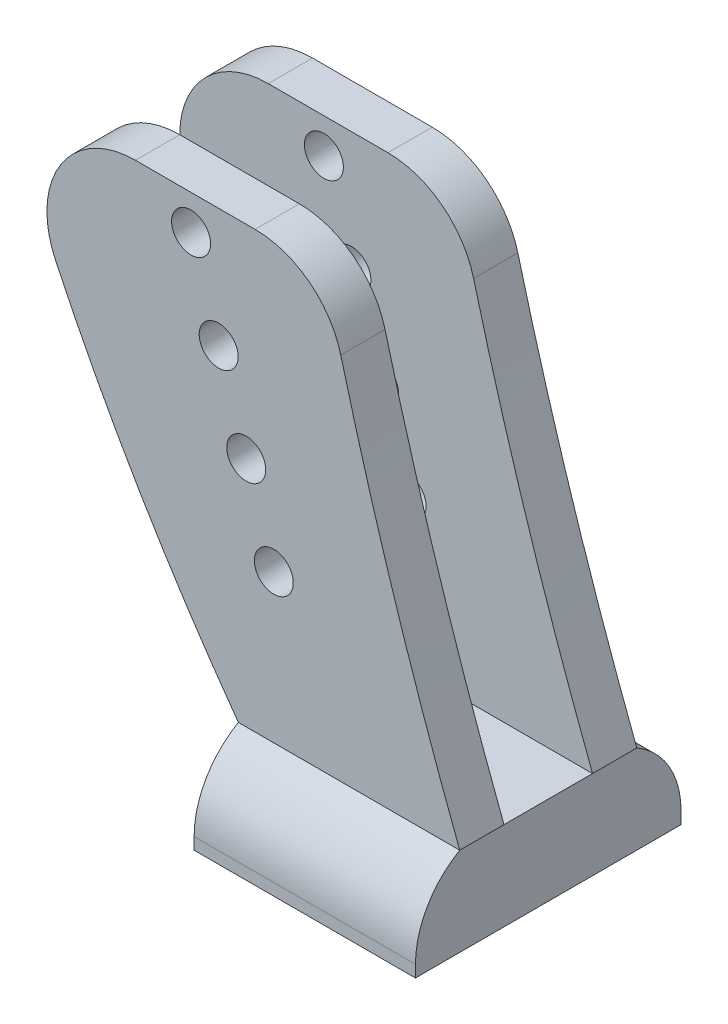
ISO-10303-21;
HEADER;
FILE_DESCRIPTION(('STEP AP214'),'2;1');
FILE_NAME('part.step','',(''),(''),'','','');
FILE_SCHEMA(('AUTOMOTIVE_DESIGN { 1 0 10303 214 1 1 1 1 }'));
ENDSEC;
DATA;
#1=APPLICATION_CONTEXT('core data for automotive mechanical design processes');
#2=APPLICATION_PROTOCOL_DEFINITION('international standard','automotive_design',2000,#1);
#3=PRODUCT_CONTEXT('',#1,'mechanical');
#4=PRODUCT('Part','Part','',(#3));
#5=PRODUCT_RELATED_PRODUCT_CATEGORY('part','',(#4));
#6=PRODUCT_DEFINITION_FORMATION('','',#4);
#7=PRODUCT_DEFINITION_CONTEXT('part definition',#1,'design');
#8=PRODUCT_DEFINITION('design','',#6,#7);
#9=PRODUCT_DEFINITION_SHAPE('','',#8);
#10=(LENGTH_UNIT() NAMED_UNIT(*) SI_UNIT(.MILLI.,.METRE.));
#11=(NAMED_UNIT(*) PLANE_ANGLE_UNIT() SI_UNIT($,.RADIAN.));
#12=(NAMED_UNIT(*) SI_UNIT($,.STERADIAN.) SOLID_ANGLE_UNIT());
#13=UNCERTAINTY_MEASURE_WITH_UNIT(LENGTH_MEASURE(1.E-05),#10,'distance_accuracy_value','');
#14=(GEOMETRIC_REPRESENTATION_CONTEXT(3) GLOBAL_UNCERTAINTY_ASSIGNED_CONTEXT((#13)) GLOBAL_UNIT_ASSIGNED_CONTEXT((#10,
#11,#12)) REPRESENTATION_CONTEXT('',''));
#15=CARTESIAN_POINT('',(0.,0.,0.));
#16=DIRECTION('',(0.,0.,1.));
#17=DIRECTION('',(1.,0.,0.));
#18=AXIS2_PLACEMENT_3D('',#15,#16,#17);
#19=CARTESIAN_POINT('',(0.,29.5863683971318,5.));
#20=DIRECTION('',(0.,-1.,0.));
#21=DIRECTION('',(0.,0.,-1.));
#22=AXIS2_PLACEMENT_3D('',#19,#20,#21);
#23=PLANE('',#22);
#24=DIRECTION('',(-1.,0.,0.));
#25=VECTOR('',#24,1.);
#26=CARTESIAN_POINT('',(-20.,29.5863683971318,-2.5));
#27=LINE('',#26,#25);
#28=CARTESIAN_POINT('',(-5.30285763988295,29.5863683971318,-2.5));
#29=VERTEX_POINT('',#28);
#30=CARTESIAN_POINT('',(-12.0614701095576,29.5863683971318,-2.5));
#31=VERTEX_POINT('',#30);
#32=EDGE_CURVE('E416',#29,#31,#27,.T.);
#33=ORIENTED_EDGE('',*,*,#32,.F.);
#34=DIRECTION('',(0.,0.,1.));
#35=VECTOR('',#34,1.);
#36=CARTESIAN_POINT('',(-5.30285763988295,29.5863683971318,-5.));
#37=LINE('',#36,#35);
#38=CARTESIAN_POINT('',(-5.30285763988295,29.5863683971318,-5.));
#39=VERTEX_POINT('',#38);
#40=EDGE_CURVE('E273',#29,#39,#37,.F.);
#41=ORIENTED_EDGE('',*,*,#40,.T.);
#42=DIRECTION('',(-1.,0.,0.));
#43=VECTOR('',#42,1.);
#44=CARTESIAN_POINT('',(0.,29.5863683971318,-5.));
#45=LINE('',#44,#43);
#46=CARTESIAN_POINT('',(-12.0614701095576,29.5863683971318,-5.));
#47=VERTEX_POINT('',#46);
#48=EDGE_CURVE('E323',#39,#47,#45,.T.);
#49=ORIENTED_EDGE('',*,*,#48,.T.);
#50=DIRECTION('',(0.,0.,-1.));
#51=VECTOR('',#50,1.);
#52=CARTESIAN_POINT('',(-12.0614701095576,29.5863683971318,5.));
#53=LINE('',#52,#51);
#54=EDGE_CURVE('E270',#47,#31,#53,.F.);
#55=ORIENTED_EDGE('',*,*,#54,.T.);
#56=EDGE_LOOP('',(#33,#41,#49,#55));
#57=FACE_BOUND('',#56,.T.);
#58=ADVANCED_FACE('F40',(#57),#23,.F.);
#59=CARTESIAN_POINT('',(82.8336258581263,69.5298969778302,5.));
#60=DIRECTION('',(0.,0.,-1.));
#61=DIRECTION('',(-1.,0.,0.));
#62=AXIS2_PLACEMENT_3D('',#59,#60,#61);
#63=CYLINDRICAL_SURFACE('',#62,110.);
#64=CARTESIAN_POINT('',(82.8336258581263,69.5298969778302,-2.5));
#65=DIRECTION('',(0.,0.,-1.));
#66=DIRECTION('',(-1.,0.,0.));
#67=AXIS2_PLACEMENT_3D('',#64,#65,#66);
#68=CIRCLE('',#67,110.);
#69=CARTESIAN_POINT('',(-6.24999999999994,5.,-2.5));
#70=VERTEX_POINT('',#69);
#71=CARTESIAN_POINT('',(-16.5802842032568,22.4462003694794,-2.5));
#72=VERTEX_POINT('',#71);
#73=EDGE_CURVE('E185',#70,#72,#68,.T.);
#74=ORIENTED_EDGE('',*,*,#73,.T.);
#75=DIRECTION('',(0.,0.,-1.));
#76=VECTOR('',#75,1.);
#77=CARTESIAN_POINT('',(-16.5802842032569,22.4462003694794,5.));
#78=LINE('',#77,#76);
#79=CARTESIAN_POINT('',(-16.5802842032568,22.4462003694794,-5.));
#80=VERTEX_POINT('',#79);
#81=EDGE_CURVE('E292',#72,#80,#78,.T.);
#82=ORIENTED_EDGE('',*,*,#81,.T.);
#83=CARTESIAN_POINT('',(82.8336258581263,69.5298969778302,-5.));
#84=DIRECTION('',(0.,0.,-1.));
#85=DIRECTION('',(-1.,0.,0.));
#86=AXIS2_PLACEMENT_3D('',#83,#84,#85);
#87=CIRCLE('',#86,110.);
#88=CARTESIAN_POINT('',(-6.25,5.,-5.));
#89=VERTEX_POINT('',#88);
#90=EDGE_CURVE('E210',#80,#89,#87,.F.);
#91=ORIENTED_EDGE('',*,*,#90,.T.);
#92=DIRECTION('',(0.,0.,-1.));
#93=VECTOR('',#92,1.);
#94=CARTESIAN_POINT('',(-6.25,5.,5.));
#95=LINE('',#94,#93);
#96=EDGE_CURVE('E200',#70,#89,#95,.T.);
#97=ORIENTED_EDGE('',*,*,#96,.F.);
#98=EDGE_LOOP('',(#74,#82,#91,#97));
#99=FACE_BOUND('',#98,.T.);
#100=ADVANCED_FACE('F449',(#99),#63,.T.);
#101=CARTESIAN_POINT('',(-4.24954389251572,13.3691989771711,5.));
#102=DIRECTION('',(0.,0.,-1.));
#103=DIRECTION('',(-1.,0.,0.));
#104=AXIS2_PLACEMENT_3D('',#101,#102,#103);
#105=CYLINDRICAL_SURFACE('',#104,1.10000000000001);
#106=CARTESIAN_POINT('',(-4.24954389251572,13.3691989771711,-2.5));
#107=DIRECTION('',(0.,0.,-1.));
#108=DIRECTION('',(-1.,0.,0.));
#109=AXIS2_PLACEMENT_3D('',#106,#107,#108);
#110=CIRCLE('',#109,1.10000000000001);
#111=CARTESIAN_POINT('',(-5.34954389251572,13.3691989771711,-2.5));
#112=VERTEX_POINT('',#111);
#113=EDGE_CURVE('E384',#112,#112,#110,.F.);
#114=ORIENTED_EDGE('',*,*,#113,.T.);
#115=EDGE_LOOP('',(#114));
#116=FACE_BOUND('',#115,.T.);
#117=CARTESIAN_POINT('',(-4.24954389251572,13.3691989771711,-5.));
#118=DIRECTION('',(0.,0.,-1.));
#119=DIRECTION('',(-1.,0.,0.));
#120=AXIS2_PLACEMENT_3D('',#117,#118,#119);
#121=CIRCLE('',#120,1.10000000000001);
#122=CARTESIAN_POINT('',(-5.34954389251572,13.3691989771711,-5.));
#123=VERTEX_POINT('',#122);
#124=EDGE_CURVE('E338',#123,#123,#121,.T.);
#125=ORIENTED_EDGE('',*,*,#124,.T.);
#126=EDGE_LOOP('',(#125));
#127=FACE_BOUND('',#126,.T.);
#128=ADVANCED_FACE('F471',(#116,#127),#105,.F.);
#129=CARTESIAN_POINT('',(-5.80678434768063,18.1205148122633,5.));
#130=DIRECTION('',(0.,0.,-1.));
#131=DIRECTION('',(-1.,0.,0.));
#132=AXIS2_PLACEMENT_3D('',#129,#130,#131);
#133=CYLINDRICAL_SURFACE('',#132,1.10000000000001);
#134=CARTESIAN_POINT('',(-5.80678434768063,18.1205148122633,-2.5));
#135=DIRECTION('',(0.,0.,-1.));
#136=DIRECTION('',(-1.,0.,0.));
#137=AXIS2_PLACEMENT_3D('',#134,#135,#136);
#138=CIRCLE('',#137,1.10000000000001);
#139=CARTESIAN_POINT('',(-6.90678434768064,18.1205148122633,-2.5));
#140=VERTEX_POINT('',#139);
#141=EDGE_CURVE('E388',#140,#140,#138,.F.);
#142=ORIENTED_EDGE('',*,*,#141,.T.);
#143=EDGE_LOOP('',(#142));
#144=FACE_BOUND('',#143,.T.);
#145=CARTESIAN_POINT('',(-5.80678434768063,18.1205148122633,-5.));
#146=DIRECTION('',(0.,0.,-1.));
#147=DIRECTION('',(-1.,0.,0.));
#148=AXIS2_PLACEMENT_3D('',#145,#146,#147);
#149=CIRCLE('',#148,1.10000000000001);
#150=CARTESIAN_POINT('',(-6.90678434768064,18.1205148122633,-5.));
#151=VERTEX_POINT('',#150);
#152=EDGE_CURVE('E342',#151,#151,#149,.T.);
#153=ORIENTED_EDGE('',*,*,#152,.T.);
#154=EDGE_LOOP('',(#153));
#155=FACE_BOUND('',#154,.T.);
#156=ADVANCED_FACE('F539',(#144,#155),#133,.F.);
#157=CARTESIAN_POINT('',(-7.36402480284555,22.8718306473555,5.));
#158=DIRECTION('',(0.,0.,-1.));
#159=DIRECTION('',(-1.,0.,0.));
#160=AXIS2_PLACEMENT_3D('',#157,#158,#159);
#161=CYLINDRICAL_SURFACE('',#160,1.10000000000001);
#162=CARTESIAN_POINT('',(-7.36402480284555,22.8718306473555,-2.5));
#163=DIRECTION('',(0.,0.,-1.));
#164=DIRECTION('',(-1.,0.,0.));
#165=AXIS2_PLACEMENT_3D('',#162,#163,#164);
#166=CIRCLE('',#165,1.10000000000001);
#167=CARTESIAN_POINT('',(-8.46402480284555,22.8718306473555,-2.5));
#168=VERTEX_POINT('',#167);
#169=EDGE_CURVE('E392',#168,#168,#166,.F.);
#170=ORIENTED_EDGE('',*,*,#169,.T.);
#171=EDGE_LOOP('',(#170));
#172=FACE_BOUND('',#171,.T.);
#173=CARTESIAN_POINT('',(-7.36402480284555,22.8718306473555,-5.));
#174=DIRECTION('',(0.,0.,-1.));
#175=DIRECTION('',(-1.,0.,0.));
#176=AXIS2_PLACEMENT_3D('',#173,#174,#175);
#177=CIRCLE('',#176,1.10000000000001);
#178=CARTESIAN_POINT('',(-8.46402480284555,22.8718306473555,-5.));
#179=VERTEX_POINT('',#178);
#180=EDGE_CURVE('E346',#179,#179,#177,.T.);
#181=ORIENTED_EDGE('',*,*,#180,.T.);
#182=EDGE_LOOP('',(#181));
#183=FACE_BOUND('',#182,.T.);
#184=ADVANCED_FACE('F534',(#172,#183),#161,.F.);
#185=CARTESIAN_POINT('',(-8.92126525801046,27.6231464824477,5.));
#186=DIRECTION('',(0.,0.,-1.));
#187=DIRECTION('',(-1.,0.,0.));
#188=AXIS2_PLACEMENT_3D('',#185,#186,#187);
#189=CYLINDRICAL_SURFACE('',#188,1.10000000000001);
#190=CARTESIAN_POINT('',(-8.92126525801046,27.6231464824477,-2.5));
#191=DIRECTION('',(0.,0.,-1.));
#192=DIRECTION('',(-1.,0.,0.));
#193=AXIS2_PLACEMENT_3D('',#190,#191,#192);
#194=CIRCLE('',#193,1.10000000000001);
#195=CARTESIAN_POINT('',(-10.0212652580105,27.6231464824477,-2.5));
#196=VERTEX_POINT('',#195);
#197=EDGE_CURVE('E167',#196,#196,#194,.F.);
#198=ORIENTED_EDGE('',*,*,#197,.T.);
#199=EDGE_LOOP('',(#198));
#200=FACE_BOUND('',#199,.T.);
#201=CARTESIAN_POINT('',(-8.92126525801046,27.6231464824477,-5.));
#202=DIRECTION('',(0.,0.,-1.));
#203=DIRECTION('',(-1.,0.,0.));
#204=AXIS2_PLACEMENT_3D('',#201,#202,#203);
#205=CIRCLE('',#204,1.10000000000001);
#206=CARTESIAN_POINT('',(-10.0212652580105,27.6231464824477,-5.));
#207=VERTEX_POINT('',#206);
#208=EDGE_CURVE('E184',#207,#207,#205,.T.);
#209=ORIENTED_EDGE('',*,*,#208,.T.);
#210=EDGE_LOOP('',(#209));
#211=FACE_BOUND('',#210,.T.);
#212=ADVANCED_FACE('F529',(#200,#211),#189,.F.);
#213=CARTESIAN_POINT('',(192.976851013694,76.6455379665035,5.));
#214=DIRECTION('',(0.,0.,-1.));
#215=DIRECTION('',(-1.,0.,0.));
#216=AXIS2_PLACEMENT_3D('',#213,#214,#215);
#217=CYLINDRICAL_SURFACE('',#216,200.);
#218=CARTESIAN_POINT('',(192.976851013694,76.6455379665035,-5.));
#219=DIRECTION('',(0.,0.,-1.));
#220=DIRECTION('',(-1.,0.,0.));
#221=AXIS2_PLACEMENT_3D('',#218,#219,#220);
#222=CIRCLE('',#221,200.);
#223=CARTESIAN_POINT('',(-0.466767184917616,25.8561042402872,-5.));
#224=VERTEX_POINT('',#223);
#225=CARTESIAN_POINT('',(6.25,5.,-5.));
#226=VERTEX_POINT('',#225);
#227=EDGE_CURVE('E315',#224,#226,#222,.F.);
#228=ORIENTED_EDGE('',*,*,#227,.F.);
#229=DIRECTION('',(0.,0.,-1.));
#230=VECTOR('',#229,1.);
#231=CARTESIAN_POINT('',(-0.466767184917644,25.8561042402872,5.));
#232=LINE('',#231,#230);
#233=CARTESIAN_POINT('',(-0.466767184917616,25.8561042402872,-2.5));
#234=VERTEX_POINT('',#233);
#235=EDGE_CURVE('E283',#224,#234,#232,.F.);
#236=ORIENTED_EDGE('',*,*,#235,.T.);
#237=CARTESIAN_POINT('',(192.976851013694,76.6455379665035,-2.5));
#238=DIRECTION('',(0.,0.,-1.));
#239=DIRECTION('',(-1.,0.,0.));
#240=AXIS2_PLACEMENT_3D('',#237,#238,#239);
#241=CIRCLE('',#240,200.);
#242=CARTESIAN_POINT('',(6.25000000000006,4.99999999999999,-2.5));
#243=VERTEX_POINT('',#242);
#244=EDGE_CURVE('E242',#243,#234,#241,.T.);
#245=ORIENTED_EDGE('',*,*,#244,.F.);
#246=DIRECTION('',(0.,0.,-1.));
#247=VECTOR('',#246,1.);
#248=CARTESIAN_POINT('',(6.25,5.,5.));
#249=LINE('',#248,#247);
#250=EDGE_CURVE('E215',#243,#226,#249,.T.);
#251=ORIENTED_EDGE('',*,*,#250,.T.);
#252=EDGE_LOOP('',(#228,#236,#245,#251));
#253=FACE_BOUND('',#252,.T.);
#254=ADVANCED_FACE('F326',(#253),#217,.F.);
#255=CARTESIAN_POINT('',(6.25,5.,7.5));
#256=DIRECTION('',(-1.,0.,0.));
#257=DIRECTION('',(0.,0.,1.));
#258=AXIS2_PLACEMENT_3D('',#255,#256,#257);
#259=PLANE('',#258);
#260=DIRECTION('',(0.,-1.,0.));
#261=VECTOR('',#260,1.);
#262=CARTESIAN_POINT('',(6.25,5.,-7.5));
#263=LINE('',#262,#261);
#264=CARTESIAN_POINT('',(6.25,0.669872981077808,-7.5));
#265=VERTEX_POINT('',#264);
#266=CARTESIAN_POINT('',(6.25,0.,-7.5));
#267=VERTEX_POINT('',#266);
#268=EDGE_CURVE('E237',#265,#267,#263,.T.);
#269=ORIENTED_EDGE('',*,*,#268,.F.);
#270=CARTESIAN_POINT('',(6.25,0.669872981077808,-2.5));
#271=DIRECTION('',(-1.,0.,0.));
#272=DIRECTION('',(0.,0.,1.));
#273=AXIS2_PLACEMENT_3D('',#270,#271,#272);
#274=CIRCLE('',#273,5.);
#275=EDGE_CURVE('E49',#265,#226,#274,.F.);
#276=ORIENTED_EDGE('',*,*,#275,.T.);
#277=ORIENTED_EDGE('',*,*,#250,.F.);
#278=CARTESIAN_POINT('',(6.25000000000006,4.99999999999999,2.5));
#279=VERTEX_POINT('',#278);
#280=EDGE_CURVE('E214',#279,#243,#249,.T.);
#281=ORIENTED_EDGE('',*,*,#280,.F.);
#282=CARTESIAN_POINT('',(6.25,5.,5.));
#283=VERTEX_POINT('',#282);
#284=EDGE_CURVE('E207',#283,#279,#249,.T.);
#285=ORIENTED_EDGE('',*,*,#284,.F.);
#286=CARTESIAN_POINT('',(6.25,0.669872981077807,2.5));
#287=DIRECTION('',(-1.,0.,0.));
#288=DIRECTION('',(0.,0.,1.));
#289=AXIS2_PLACEMENT_3D('',#286,#287,#288);
#290=CIRCLE('',#289,5.);
#291=CARTESIAN_POINT('',(6.25,0.669872981077807,7.5));
#292=VERTEX_POINT('',#291);
#293=EDGE_CURVE('E56',#283,#292,#290,.F.);
#294=ORIENTED_EDGE('',*,*,#293,.T.);
#295=DIRECTION('',(0.,-1.,0.));
#296=VECTOR('',#295,1.);
#297=CARTESIAN_POINT('',(6.25,5.,7.5));
#298=LINE('',#297,#296);
#299=CARTESIAN_POINT('',(6.25,0.,7.5));
#300=VERTEX_POINT('',#299);
#301=EDGE_CURVE('E228',#292,#300,#298,.T.);
#302=ORIENTED_EDGE('',*,*,#301,.T.);
#303=DIRECTION('',(0.,0.,-1.));
#304=VECTOR('',#303,1.);
#305=CARTESIAN_POINT('',(6.25,0.,7.5));
#306=LINE('',#305,#304);
#307=EDGE_CURVE('E199',#300,#267,#306,.T.);
#308=ORIENTED_EDGE('',*,*,#307,.T.);
#309=EDGE_LOOP('',(#269,#276,#277,#281,#285,#294,#302,#308));
#310=FACE_BOUND('',#309,.T.);
#311=ADVANCED_FACE('F308',(#310),#259,.F.);
#312=CARTESIAN_POINT('',(-6.25,5.,-7.5));
#313=DIRECTION('',(0.,0.,1.));
#314=DIRECTION('',(1.,0.,0.));
#315=AXIS2_PLACEMENT_3D('',#312,#313,#314);
#316=PLANE('',#315);
#317=DIRECTION('',(0.,-1.,0.));
#318=VECTOR('',#317,1.);
#319=CARTESIAN_POINT('',(-6.25,5.,-7.5));
#320=LINE('',#319,#318);
#321=CARTESIAN_POINT('',(-6.25,0.669872981077808,-7.5));
#322=VERTEX_POINT('',#321);
#323=CARTESIAN_POINT('',(-6.25,0.,-7.5));
#324=VERTEX_POINT('',#323);
#325=EDGE_CURVE('E234',#322,#324,#320,.T.);
#326=ORIENTED_EDGE('',*,*,#325,.F.);
#327=DIRECTION('',(1.,0.,0.));
#328=VECTOR('',#327,1.);
#329=CARTESIAN_POINT('',(-6.25,0.669872981077808,-7.5));
#330=LINE('',#329,#328);
#331=EDGE_CURVE('E64',#322,#265,#330,.T.);
#332=ORIENTED_EDGE('',*,*,#331,.T.);
#333=ORIENTED_EDGE('',*,*,#268,.T.);
#334=DIRECTION('',(-1.,0.,0.));
#335=VECTOR('',#334,1.);
#336=CARTESIAN_POINT('',(-6.25,0.,-7.5));
#337=LINE('',#336,#335);
#338=EDGE_CURVE('E205',#267,#324,#337,.T.);
#339=ORIENTED_EDGE('',*,*,#338,.T.);
#340=EDGE_LOOP('',(#326,#332,#333,#339));
#341=FACE_BOUND('',#340,.T.);
#342=ADVANCED_FACE('F497',(#341),#316,.F.);
#343=CARTESIAN_POINT('',(-6.25,5.,7.5));
#344=DIRECTION('',(1.,0.,0.));
#345=DIRECTION('',(0.,0.,-1.));
#346=AXIS2_PLACEMENT_3D('',#343,#344,#345);
#347=PLANE('',#346);
#348=ORIENTED_EDGE('',*,*,#96,.T.);
#349=CARTESIAN_POINT('',(-6.25,0.669872981077808,-2.5));
#350=DIRECTION('',(1.,0.,0.));
#351=DIRECTION('',(0.,0.,-1.));
#352=AXIS2_PLACEMENT_3D('',#349,#350,#351);
#353=CIRCLE('',#352,5.);
#354=EDGE_CURVE('E298',#89,#322,#353,.F.);
#355=ORIENTED_EDGE('',*,*,#354,.T.);
#356=ORIENTED_EDGE('',*,*,#325,.T.);
#357=DIRECTION('',(0.,0.,1.));
#358=VECTOR('',#357,1.);
#359=CARTESIAN_POINT('',(-6.25,0.,7.5));
#360=LINE('',#359,#358);
#361=CARTESIAN_POINT('',(-6.25,0.,7.5));
#362=VERTEX_POINT('',#361);
#363=EDGE_CURVE('E220',#324,#362,#360,.T.);
#364=ORIENTED_EDGE('',*,*,#363,.T.);
#365=DIRECTION('',(0.,-1.,0.));
#366=VECTOR('',#365,1.);
#367=CARTESIAN_POINT('',(-6.25,5.,7.5));
#368=LINE('',#367,#366);
#369=CARTESIAN_POINT('',(-6.25,0.669872981077807,7.5));
#370=VERTEX_POINT('',#369);
#371=EDGE_CURVE('E231',#370,#362,#368,.T.);
#372=ORIENTED_EDGE('',*,*,#371,.F.);
#373=CARTESIAN_POINT('',(-6.25,0.669872981077807,2.5));
#374=DIRECTION('',(1.,0.,0.));
#375=DIRECTION('',(0.,0.,-1.));
#376=AXIS2_PLACEMENT_3D('',#373,#374,#375);
#377=CIRCLE('',#376,5.);
#378=CARTESIAN_POINT('',(-6.25,5.,5.));
#379=VERTEX_POINT('',#378);
#380=EDGE_CURVE('E196',#370,#379,#377,.F.);
#381=ORIENTED_EDGE('',*,*,#380,.T.);
#382=CARTESIAN_POINT('',(-6.24999999999994,5.,2.5));
#383=VERTEX_POINT('',#382);
#384=EDGE_CURVE('E160',#379,#383,#95,.T.);
#385=ORIENTED_EDGE('',*,*,#384,.T.);
#386=DIRECTION('',(0.,0.,-1.));
#387=VECTOR('',#386,1.);
#388=CARTESIAN_POINT('',(-6.24999999999994,5.,5.));
#389=LINE('',#388,#387);
#390=EDGE_CURVE('E174',#383,#70,#389,.T.);
#391=ORIENTED_EDGE('',*,*,#390,.T.);
#392=EDGE_LOOP('',(#348,#355,#356,#364,#372,#381,#385,#391));
#393=FACE_BOUND('',#392,.T.);
#394=ADVANCED_FACE('F193',(#393),#347,.F.);
#395=CARTESIAN_POINT('',(-6.25,5.,7.5));
#396=DIRECTION('',(0.,0.,-1.));
#397=DIRECTION('',(-1.,0.,0.));
#398=AXIS2_PLACEMENT_3D('',#395,#396,#397);
#399=PLANE('',#398);
#400=ORIENTED_EDGE('',*,*,#301,.F.);
#401=DIRECTION('',(1.,0.,0.));
#402=VECTOR('',#401,1.);
#403=CARTESIAN_POINT('',(-6.25,0.669872981077807,7.5));
#404=LINE('',#403,#402);
#405=EDGE_CURVE('E11',#292,#370,#404,.F.);
#406=ORIENTED_EDGE('',*,*,#405,.T.);
#407=ORIENTED_EDGE('',*,*,#371,.T.);
#408=DIRECTION('',(1.,0.,0.));
#409=VECTOR('',#408,1.);
#410=CARTESIAN_POINT('',(-6.25,0.,7.5));
#411=LINE('',#410,#409);
#412=EDGE_CURVE('E224',#362,#300,#411,.T.);
#413=ORIENTED_EDGE('',*,*,#412,.T.);
#414=EDGE_LOOP('',(#400,#406,#407,#413));
#415=FACE_BOUND('',#414,.T.);
#416=ADVANCED_FACE('F482',(#415),#399,.F.);
#417=CARTESIAN_POINT('',(0.,0.,0.));
#418=DIRECTION('',(0.,-1.,0.));
#419=DIRECTION('',(0.,0.,-1.));
#420=AXIS2_PLACEMENT_3D('',#417,#418,#419);
#421=PLANE('',#420);
#422=ORIENTED_EDGE('',*,*,#307,.F.);
#423=ORIENTED_EDGE('',*,*,#412,.F.);
#424=ORIENTED_EDGE('',*,*,#363,.F.);
#425=ORIENTED_EDGE('',*,*,#338,.F.);
#426=EDGE_LOOP('',(#422,#423,#424,#425));
#427=FACE_BOUND('',#426,.T.);
#428=ADVANCED_FACE('F476',(#427),#421,.T.);
#429=DIRECTION('',(1.,0.,0.));
#430=VECTOR('',#429,1.);
#431=CARTESIAN_POINT('',(-20.,29.5863683971318,2.5));
#432=LINE('',#431,#430);
#433=CARTESIAN_POINT('',(-12.0614701095576,29.5863683971318,2.5));
#434=VERTEX_POINT('',#433);
#435=CARTESIAN_POINT('',(-5.30285763988295,29.5863683971318,2.5));
#436=VERTEX_POINT('',#435);
#437=EDGE_CURVE('E415',#434,#436,#432,.T.);
#438=ORIENTED_EDGE('',*,*,#437,.F.);
#439=DIRECTION('',(0.,0.,-1.));
#440=VECTOR('',#439,1.);
#441=CARTESIAN_POINT('',(-12.0614701095576,29.5863683971318,5.));
#442=LINE('',#441,#440);
#443=CARTESIAN_POINT('',(-12.0614701095576,29.5863683971318,5.));
#444=VERTEX_POINT('',#443);
#445=EDGE_CURVE('E258',#434,#444,#442,.F.);
#446=ORIENTED_EDGE('',*,*,#445,.T.);
#447=DIRECTION('',(-1.,0.,0.));
#448=VECTOR('',#447,1.);
#449=CARTESIAN_POINT('',(0.,29.5863683971318,5.));
#450=LINE('',#449,#448);
#451=CARTESIAN_POINT('',(-5.30285763988295,29.5863683971318,5.));
#452=VERTEX_POINT('',#451);
#453=EDGE_CURVE('E362',#452,#444,#450,.T.);
#454=ORIENTED_EDGE('',*,*,#453,.F.);
#455=DIRECTION('',(0.,0.,1.));
#456=VECTOR('',#455,1.);
#457=CARTESIAN_POINT('',(-5.30285763988295,29.5863683971318,2.5));
#458=LINE('',#457,#456);
#459=EDGE_CURVE('E254',#452,#436,#458,.F.);
#460=ORIENTED_EDGE('',*,*,#459,.T.);
#461=EDGE_LOOP('',(#438,#446,#454,#460));
#462=FACE_BOUND('',#461,.T.);
#463=ADVANCED_FACE('F425',(#462),#23,.F.);
#464=CARTESIAN_POINT('',(82.8336258581263,69.5298969778302,5.));
#465=DIRECTION('',(0.,0.,-1.));
#466=DIRECTION('',(-1.,0.,0.));
#467=AXIS2_PLACEMENT_3D('',#464,#465,#466);
#468=CIRCLE('',#467,110.);
#469=CARTESIAN_POINT('',(-16.5802842032568,22.4462003694794,5.));
#470=VERTEX_POINT('',#469);
#471=EDGE_CURVE('E328',#470,#379,#468,.F.);
#472=ORIENTED_EDGE('',*,*,#471,.F.);
#473=DIRECTION('',(0.,0.,-1.));
#474=VECTOR('',#473,1.);
#475=CARTESIAN_POINT('',(-16.5802842032569,22.4462003694794,5.));
#476=LINE('',#475,#474);
#477=CARTESIAN_POINT('',(-16.5802842032568,22.4462003694794,2.5));
#478=VERTEX_POINT('',#477);
#479=EDGE_CURVE('E163',#470,#478,#476,.T.);
#480=ORIENTED_EDGE('',*,*,#479,.T.);
#481=CARTESIAN_POINT('',(82.8336258581263,69.5298969778302,2.5));
#482=DIRECTION('',(0.,0.,1.));
#483=DIRECTION('',(1.,0.,0.));
#484=AXIS2_PLACEMENT_3D('',#481,#482,#483);
#485=CIRCLE('',#484,110.);
#486=EDGE_CURVE('E155',#478,#383,#485,.T.);
#487=ORIENTED_EDGE('',*,*,#486,.T.);
#488=ORIENTED_EDGE('',*,*,#384,.F.);
#489=EDGE_LOOP('',(#472,#480,#487,#488));
#490=FACE_BOUND('',#489,.T.);
#491=ADVANCED_FACE('F158',(#490),#63,.T.);
#492=CARTESIAN_POINT('',(-4.24954389251572,13.3691989771711,2.5));
#493=DIRECTION('',(0.,0.,1.));
#494=DIRECTION('',(1.,0.,0.));
#495=AXIS2_PLACEMENT_3D('',#492,#493,#494);
#496=CIRCLE('',#495,1.10000000000001);
#497=CARTESIAN_POINT('',(-3.14954389251571,13.3691989771711,2.5));
#498=VERTEX_POINT('',#497);
#499=EDGE_CURVE('E168',#498,#498,#496,.F.);
#500=ORIENTED_EDGE('',*,*,#499,.T.);
#501=EDGE_LOOP('',(#500));
#502=FACE_BOUND('',#501,.T.);
#503=CARTESIAN_POINT('',(-4.24954389251572,13.3691989771711,5.));
#504=DIRECTION('',(0.,0.,-1.));
#505=DIRECTION('',(-1.,0.,0.));
#506=AXIS2_PLACEMENT_3D('',#503,#504,#505);
#507=CIRCLE('',#506,1.10000000000001);
#508=CARTESIAN_POINT('',(-5.34954389251572,13.3691989771711,5.));
#509=VERTEX_POINT('',#508);
#510=EDGE_CURVE('E366',#509,#509,#507,.T.);
#511=ORIENTED_EDGE('',*,*,#510,.F.);
#512=EDGE_LOOP('',(#511));
#513=FACE_BOUND('',#512,.T.);
#514=ADVANCED_FACE('F481',(#502,#513),#105,.F.);
#515=CARTESIAN_POINT('',(-5.80678434768063,18.1205148122633,2.5));
#516=DIRECTION('',(0.,0.,1.));
#517=DIRECTION('',(1.,0.,0.));
#518=AXIS2_PLACEMENT_3D('',#515,#516,#517);
#519=CIRCLE('',#518,1.10000000000001);
#520=CARTESIAN_POINT('',(-4.70678434768062,18.1205148122633,2.5));
#521=VERTEX_POINT('',#520);
#522=EDGE_CURVE('E402',#521,#521,#519,.F.);
#523=ORIENTED_EDGE('',*,*,#522,.T.);
#524=EDGE_LOOP('',(#523));
#525=FACE_BOUND('',#524,.T.);
#526=CARTESIAN_POINT('',(-5.80678434768063,18.1205148122633,5.));
#527=DIRECTION('',(0.,0.,-1.));
#528=DIRECTION('',(-1.,0.,0.));
#529=AXIS2_PLACEMENT_3D('',#526,#527,#528);
#530=CIRCLE('',#529,1.10000000000001);
#531=CARTESIAN_POINT('',(-6.90678434768064,18.1205148122633,5.));
#532=VERTEX_POINT('',#531);
#533=EDGE_CURVE('E370',#532,#532,#530,.T.);
#534=ORIENTED_EDGE('',*,*,#533,.F.);
#535=EDGE_LOOP('',(#534));
#536=FACE_BOUND('',#535,.T.);
#537=ADVANCED_FACE('F558',(#525,#536),#133,.F.);
#538=CARTESIAN_POINT('',(-7.36402480284555,22.8718306473555,2.5));
#539=DIRECTION('',(0.,0.,1.));
#540=DIRECTION('',(1.,0.,0.));
#541=AXIS2_PLACEMENT_3D('',#538,#539,#540);
#542=CIRCLE('',#541,1.10000000000001);
#543=CARTESIAN_POINT('',(-6.26402480284554,22.8718306473555,2.5));
#544=VERTEX_POINT('',#543);
#545=EDGE_CURVE('E406',#544,#544,#542,.F.);
#546=ORIENTED_EDGE('',*,*,#545,.T.);
#547=EDGE_LOOP('',(#546));
#548=FACE_BOUND('',#547,.T.);
#549=CARTESIAN_POINT('',(-7.36402480284555,22.8718306473555,5.));
#550=DIRECTION('',(0.,0.,-1.));
#551=DIRECTION('',(-1.,0.,0.));
#552=AXIS2_PLACEMENT_3D('',#549,#550,#551);
#553=CIRCLE('',#552,1.10000000000001);
#554=CARTESIAN_POINT('',(-8.46402480284555,22.8718306473555,5.));
#555=VERTEX_POINT('',#554);
#556=EDGE_CURVE('E374',#555,#555,#553,.T.);
#557=ORIENTED_EDGE('',*,*,#556,.F.);
#558=EDGE_LOOP('',(#557));
#559=FACE_BOUND('',#558,.T.);
#560=ADVANCED_FACE('F527',(#548,#559),#161,.F.);
#561=CARTESIAN_POINT('',(-8.92126525801046,27.6231464824477,2.5));
#562=DIRECTION('',(0.,0.,1.));
#563=DIRECTION('',(1.,0.,0.));
#564=AXIS2_PLACEMENT_3D('',#561,#562,#563);
#565=CIRCLE('',#564,1.10000000000001);
#566=CARTESIAN_POINT('',(-7.82126525801046,27.6231464824477,2.5));
#567=VERTEX_POINT('',#566);
#568=EDGE_CURVE('E191',#567,#567,#565,.F.);
#569=ORIENTED_EDGE('',*,*,#568,.T.);
#570=EDGE_LOOP('',(#569));
#571=FACE_BOUND('',#570,.T.);
#572=CARTESIAN_POINT('',(-8.92126525801046,27.6231464824477,5.));
#573=DIRECTION('',(0.,0.,-1.));
#574=DIRECTION('',(-1.,0.,0.));
#575=AXIS2_PLACEMENT_3D('',#572,#573,#574);
#576=CIRCLE('',#575,1.10000000000001);
#577=CARTESIAN_POINT('',(-10.0212652580105,27.6231464824477,5.));
#578=VERTEX_POINT('',#577);
#579=EDGE_CURVE('E333',#578,#578,#576,.T.);
#580=ORIENTED_EDGE('',*,*,#579,.F.);
#581=EDGE_LOOP('',(#580));
#582=FACE_BOUND('',#581,.T.);
#583=ADVANCED_FACE('F492',(#571,#582),#189,.F.);
#584=CARTESIAN_POINT('',(192.976851013694,76.6455379665035,2.5));
#585=DIRECTION('',(0.,0.,1.));
#586=DIRECTION('',(1.,0.,0.));
#587=AXIS2_PLACEMENT_3D('',#584,#585,#586);
#588=CIRCLE('',#587,200.);
#589=CARTESIAN_POINT('',(-0.466767184917616,25.8561042402872,2.5));
#590=VERTEX_POINT('',#589);
#591=EDGE_CURVE('E189',#590,#279,#588,.T.);
#592=ORIENTED_EDGE('',*,*,#591,.F.);
#593=DIRECTION('',(0.,0.,-1.));
#594=VECTOR('',#593,1.);
#595=CARTESIAN_POINT('',(-0.466767184917644,25.8561042402872,5.));
#596=LINE('',#595,#594);
#597=CARTESIAN_POINT('',(-0.466767184917616,25.8561042402872,5.));
#598=VERTEX_POINT('',#597);
#599=EDGE_CURVE('E267',#590,#598,#596,.F.);
#600=ORIENTED_EDGE('',*,*,#599,.T.);
#601=CARTESIAN_POINT('',(192.976851013694,76.6455379665035,5.));
#602=DIRECTION('',(0.,0.,-1.));
#603=DIRECTION('',(-1.,0.,0.));
#604=AXIS2_PLACEMENT_3D('',#601,#602,#603);
#605=CIRCLE('',#604,200.);
#606=EDGE_CURVE('E358',#598,#283,#605,.F.);
#607=ORIENTED_EDGE('',*,*,#606,.T.);
#608=ORIENTED_EDGE('',*,*,#284,.T.);
#609=EDGE_LOOP('',(#592,#600,#607,#608));
#610=FACE_BOUND('',#609,.T.);
#611=ADVANCED_FACE('F440',(#610),#217,.F.);
#612=CARTESIAN_POINT('',(0.,0.,5.));
#613=DIRECTION('',(0.,0.,-1.));
#614=DIRECTION('',(-1.,0.,0.));
#615=AXIS2_PLACEMENT_3D('',#612,#613,#614);
#616=PLANE('',#615);
#617=ORIENTED_EDGE('',*,*,#579,.T.);
#618=EDGE_LOOP('',(#617));
#619=FACE_BOUND('',#618,.T.);
#620=ORIENTED_EDGE('',*,*,#556,.T.);
#621=EDGE_LOOP('',(#620));
#622=FACE_BOUND('',#621,.T.);
#623=ORIENTED_EDGE('',*,*,#533,.T.);
#624=EDGE_LOOP('',(#623));
#625=FACE_BOUND('',#624,.T.);
#626=ORIENTED_EDGE('',*,*,#510,.T.);
#627=EDGE_LOOP('',(#626));
#628=FACE_BOUND('',#627,.T.);
#629=ORIENTED_EDGE('',*,*,#453,.T.);
#630=CARTESIAN_POINT('',(-12.0614701095576,24.5863683971318,5.));
#631=DIRECTION('',(0.,0.,-1.));
#632=DIRECTION('',(-1.,0.,0.));
#633=AXIS2_PLACEMENT_3D('',#630,#631,#632);
#634=CIRCLE('',#633,5.);
#635=EDGE_CURVE('E264',#444,#470,#634,.F.);
#636=ORIENTED_EDGE('',*,*,#635,.T.);
#637=ORIENTED_EDGE('',*,*,#471,.T.);
#638=DIRECTION('',(-1.,0.,0.));
#639=VECTOR('',#638,1.);
#640=CARTESIAN_POINT('',(0.,5.,5.));
#641=LINE('',#640,#639);
#642=EDGE_CURVE('E355',#283,#379,#641,.T.);
#643=ORIENTED_EDGE('',*,*,#642,.F.);
#644=ORIENTED_EDGE('',*,*,#606,.F.);
#645=CARTESIAN_POINT('',(-5.30285763988295,24.5863683971318,5.));
#646=DIRECTION('',(0.,0.,-1.));
#647=DIRECTION('',(-1.,0.,0.));
#648=AXIS2_PLACEMENT_3D('',#645,#646,#647);
#649=CIRCLE('',#648,5.);
#650=EDGE_CURVE('E261',#598,#452,#649,.F.);
#651=ORIENTED_EDGE('',*,*,#650,.T.);
#652=EDGE_LOOP('',(#629,#636,#637,#643,#644,#651));
#653=FACE_BOUND('',#652,.T.);
#654=ADVANCED_FACE('F432',(#619,#622,#625,#628,#653),#616,.F.);
#655=CARTESIAN_POINT('',(0.,0.,-5.));
#656=DIRECTION('',(0.,0.,-1.));
#657=DIRECTION('',(-1.,0.,0.));
#658=AXIS2_PLACEMENT_3D('',#655,#656,#657);
#659=PLANE('',#658);
#660=ORIENTED_EDGE('',*,*,#208,.F.);
#661=EDGE_LOOP('',(#660));
#662=FACE_BOUND('',#661,.T.);
#663=ORIENTED_EDGE('',*,*,#180,.F.);
#664=EDGE_LOOP('',(#663));
#665=FACE_BOUND('',#664,.T.);
#666=ORIENTED_EDGE('',*,*,#152,.F.);
#667=EDGE_LOOP('',(#666));
#668=FACE_BOUND('',#667,.T.);
#669=ORIENTED_EDGE('',*,*,#124,.F.);
#670=EDGE_LOOP('',(#669));
#671=FACE_BOUND('',#670,.T.);
#672=ORIENTED_EDGE('',*,*,#48,.F.);
#673=CARTESIAN_POINT('',(-5.30285763988295,24.5863683971318,-5.));
#674=DIRECTION('',(0.,0.,-1.));
#675=DIRECTION('',(-1.,0.,0.));
#676=AXIS2_PLACEMENT_3D('',#673,#674,#675);
#677=CIRCLE('',#676,5.);
#678=EDGE_CURVE('E280',#39,#224,#677,.T.);
#679=ORIENTED_EDGE('',*,*,#678,.T.);
#680=ORIENTED_EDGE('',*,*,#227,.T.);
#681=DIRECTION('',(-1.,0.,0.));
#682=VECTOR('',#681,1.);
#683=CARTESIAN_POINT('',(0.,5.,-5.));
#684=LINE('',#683,#682);
#685=EDGE_CURVE('E319',#226,#89,#684,.T.);
#686=ORIENTED_EDGE('',*,*,#685,.T.);
#687=ORIENTED_EDGE('',*,*,#90,.F.);
#688=CARTESIAN_POINT('',(-12.0614701095576,24.5863683971318,-5.));
#689=DIRECTION('',(0.,0.,-1.));
#690=DIRECTION('',(-1.,0.,0.));
#691=AXIS2_PLACEMENT_3D('',#688,#689,#690);
#692=CIRCLE('',#691,5.);
#693=EDGE_CURVE('E277',#80,#47,#692,.T.);
#694=ORIENTED_EDGE('',*,*,#693,.T.);
#695=EDGE_LOOP('',(#672,#679,#680,#686,#687,#694));
#696=FACE_BOUND('',#695,.T.);
#697=ADVANCED_FACE('F317',(#662,#665,#668,#671,#696),#659,.T.);
#698=CARTESIAN_POINT('',(0.,5.,0.));
#699=DIRECTION('',(0.,-1.,0.));
#700=DIRECTION('',(0.,0.,-1.));
#701=AXIS2_PLACEMENT_3D('',#698,#699,#700);
#702=PLANE('',#701);
#703=DIRECTION('',(1.,0.,0.));
#704=VECTOR('',#703,1.);
#705=CARTESIAN_POINT('',(-20.,5.,2.5));
#706=LINE('',#705,#704);
#707=EDGE_CURVE('E176',#383,#279,#706,.T.);
#708=ORIENTED_EDGE('',*,*,#707,.T.);
#709=ORIENTED_EDGE('',*,*,#280,.T.);
#710=DIRECTION('',(-1.,0.,0.));
#711=VECTOR('',#710,1.);
#712=CARTESIAN_POINT('',(-20.,5.,-2.5));
#713=LINE('',#712,#711);
#714=EDGE_CURVE('E179',#243,#70,#713,.T.);
#715=ORIENTED_EDGE('',*,*,#714,.T.);
#716=ORIENTED_EDGE('',*,*,#390,.F.);
#717=EDGE_LOOP('',(#708,#709,#715,#716));
#718=FACE_BOUND('',#717,.T.);
#719=ADVANCED_FACE('F175',(#718),#702,.F.);
#720=CARTESIAN_POINT('',(-20.,-35.3112887414927,-2.5));
#721=DIRECTION('',(0.,0.,-1.));
#722=DIRECTION('',(-1.,0.,0.));
#723=AXIS2_PLACEMENT_3D('',#720,#721,#722);
#724=PLANE('',#723);
#725=ORIENTED_EDGE('',*,*,#141,.F.);
#726=EDGE_LOOP('',(#725));
#727=FACE_BOUND('',#726,.T.);
#728=ORIENTED_EDGE('',*,*,#197,.F.);
#729=EDGE_LOOP('',(#728));
#730=FACE_BOUND('',#729,.T.);
#731=ORIENTED_EDGE('',*,*,#169,.F.);
#732=EDGE_LOOP('',(#731));
#733=FACE_BOUND('',#732,.T.);
#734=ORIENTED_EDGE('',*,*,#113,.F.);
#735=EDGE_LOOP('',(#734));
#736=FACE_BOUND('',#735,.T.);
#737=ORIENTED_EDGE('',*,*,#244,.T.);
#738=CARTESIAN_POINT('',(-5.30285763988295,24.5863683971318,-2.5));
#739=DIRECTION('',(0.,0.,-1.));
#740=DIRECTION('',(-1.,0.,0.));
#741=AXIS2_PLACEMENT_3D('',#738,#739,#740);
#742=CIRCLE('',#741,5.);
#743=EDGE_CURVE('E289',#234,#29,#742,.F.);
#744=ORIENTED_EDGE('',*,*,#743,.T.);
#745=ORIENTED_EDGE('',*,*,#32,.T.);
#746=CARTESIAN_POINT('',(-12.0614701095576,24.5863683971318,-2.5));
#747=DIRECTION('',(0.,0.,-1.));
#748=DIRECTION('',(-1.,0.,0.));
#749=AXIS2_PLACEMENT_3D('',#746,#747,#748);
#750=CIRCLE('',#749,5.);
#751=EDGE_CURVE('E286',#31,#72,#750,.F.);
#752=ORIENTED_EDGE('',*,*,#751,.T.);
#753=ORIENTED_EDGE('',*,*,#73,.F.);
#754=ORIENTED_EDGE('',*,*,#714,.F.);
#755=EDGE_LOOP('',(#737,#744,#745,#752,#753,#754));
#756=FACE_BOUND('',#755,.T.);
#757=ADVANCED_FACE('F444',(#727,#730,#733,#736,#756),#724,.F.);
#758=CARTESIAN_POINT('',(-20.,-35.3112887414927,2.5));
#759=DIRECTION('',(0.,0.,1.));
#760=DIRECTION('',(1.,0.,0.));
#761=AXIS2_PLACEMENT_3D('',#758,#759,#760);
#762=PLANE('',#761);
#763=ORIENTED_EDGE('',*,*,#522,.F.);
#764=EDGE_LOOP('',(#763));
#765=FACE_BOUND('',#764,.T.);
#766=ORIENTED_EDGE('',*,*,#568,.F.);
#767=EDGE_LOOP('',(#766));
#768=FACE_BOUND('',#767,.T.);
#769=ORIENTED_EDGE('',*,*,#545,.F.);
#770=EDGE_LOOP('',(#769));
#771=FACE_BOUND('',#770,.T.);
#772=ORIENTED_EDGE('',*,*,#499,.F.);
#773=EDGE_LOOP('',(#772));
#774=FACE_BOUND('',#773,.T.);
#775=ORIENTED_EDGE('',*,*,#486,.F.);
#776=CARTESIAN_POINT('',(-12.0614701095576,24.5863683971318,2.5));
#777=DIRECTION('',(0.,0.,1.));
#778=DIRECTION('',(1.,0.,0.));
#779=AXIS2_PLACEMENT_3D('',#776,#777,#778);
#780=CIRCLE('',#779,5.);
#781=EDGE_CURVE('E251',#478,#434,#780,.F.);
#782=ORIENTED_EDGE('',*,*,#781,.T.);
#783=ORIENTED_EDGE('',*,*,#437,.T.);
#784=CARTESIAN_POINT('',(-5.30285763988295,24.5863683971318,2.5));
#785=DIRECTION('',(0.,0.,1.));
#786=DIRECTION('',(1.,0.,0.));
#787=AXIS2_PLACEMENT_3D('',#784,#785,#786);
#788=CIRCLE('',#787,5.);
#789=EDGE_CURVE('E248',#436,#590,#788,.F.);
#790=ORIENTED_EDGE('',*,*,#789,.T.);
#791=ORIENTED_EDGE('',*,*,#591,.T.);
#792=ORIENTED_EDGE('',*,*,#707,.F.);
#793=EDGE_LOOP('',(#775,#782,#783,#790,#791,#792));
#794=FACE_BOUND('',#793,.T.);
#795=ADVANCED_FACE('F187',(#765,#768,#771,#774,#794),#762,.F.);
#796=CARTESIAN_POINT('',(-12.0614701095576,24.5863683971318,5.));
#797=DIRECTION('',(0.,0.,-1.));
#798=DIRECTION('',(-1.,0.,0.));
#799=AXIS2_PLACEMENT_3D('',#796,#797,#798);
#800=CYLINDRICAL_SURFACE('',#799,5.);
#801=ORIENTED_EDGE('',*,*,#635,.F.);
#802=ORIENTED_EDGE('',*,*,#445,.F.);
#803=ORIENTED_EDGE('',*,*,#781,.F.);
#804=ORIENTED_EDGE('',*,*,#479,.F.);
#805=EDGE_LOOP('',(#801,#802,#803,#804));
#806=FACE_BOUND('',#805,.T.);
#807=ADVANCED_FACE('F430',(#806),#800,.T.);
#808=CARTESIAN_POINT('',(-5.30285763988295,24.5863683971318,5.));
#809=DIRECTION('',(0.,0.,-1.));
#810=DIRECTION('',(-1.,0.,0.));
#811=AXIS2_PLACEMENT_3D('',#808,#809,#810);
#812=CYLINDRICAL_SURFACE('',#811,5.);
#813=ORIENTED_EDGE('',*,*,#650,.F.);
#814=ORIENTED_EDGE('',*,*,#599,.F.);
#815=ORIENTED_EDGE('',*,*,#789,.F.);
#816=ORIENTED_EDGE('',*,*,#459,.F.);
#817=EDGE_LOOP('',(#813,#814,#815,#816));
#818=FACE_BOUND('',#817,.T.);
#819=ADVANCED_FACE('F437',(#818),#812,.T.);
#820=CARTESIAN_POINT('',(-5.30285763988295,24.5863683971318,5.));
#821=DIRECTION('',(0.,0.,-1.));
#822=DIRECTION('',(-1.,0.,0.));
#823=AXIS2_PLACEMENT_3D('',#820,#821,#822);
#824=CYLINDRICAL_SURFACE('',#823,5.);
#825=ORIENTED_EDGE('',*,*,#743,.F.);
#826=ORIENTED_EDGE('',*,*,#235,.F.);
#827=ORIENTED_EDGE('',*,*,#678,.F.);
#828=ORIENTED_EDGE('',*,*,#40,.F.);
#829=EDGE_LOOP('',(#825,#826,#827,#828));
#830=FACE_BOUND('',#829,.T.);
#831=ADVANCED_FACE('F457',(#830),#824,.T.);
#832=CARTESIAN_POINT('',(-12.0614701095576,24.5863683971318,5.));
#833=DIRECTION('',(0.,0.,-1.));
#834=DIRECTION('',(-1.,0.,0.));
#835=AXIS2_PLACEMENT_3D('',#832,#833,#834);
#836=CYLINDRICAL_SURFACE('',#835,5.);
#837=ORIENTED_EDGE('',*,*,#751,.F.);
#838=ORIENTED_EDGE('',*,*,#54,.F.);
#839=ORIENTED_EDGE('',*,*,#693,.F.);
#840=ORIENTED_EDGE('',*,*,#81,.F.);
#841=EDGE_LOOP('',(#837,#838,#839,#840));
#842=FACE_BOUND('',#841,.T.);
#843=ADVANCED_FACE('F451',(#842),#836,.T.);
#844=CARTESIAN_POINT('',(0.,0.669872981077808,-2.5));
#845=DIRECTION('',(1.,0.,0.));
#846=DIRECTION('',(0.,0.,-1.));
#847=AXIS2_PLACEMENT_3D('',#844,#845,#846);
#848=CYLINDRICAL_SURFACE('',#847,5.);
#849=ORIENTED_EDGE('',*,*,#275,.F.);
#850=ORIENTED_EDGE('',*,*,#331,.F.);
#851=ORIENTED_EDGE('',*,*,#354,.F.);
#852=ORIENTED_EDGE('',*,*,#685,.F.);
#853=EDGE_LOOP('',(#849,#850,#851,#852));
#854=FACE_BOUND('',#853,.T.);
#855=ADVANCED_FACE('F329',(#854),#848,.T.);
#856=CARTESIAN_POINT('',(0.,0.669872981077807,2.5));
#857=DIRECTION('',(1.,0.,0.));
#858=DIRECTION('',(0.,0.,-1.));
#859=AXIS2_PLACEMENT_3D('',#856,#857,#858);
#860=CYLINDRICAL_SURFACE('',#859,5.);
#861=ORIENTED_EDGE('',*,*,#380,.F.);
#862=ORIENTED_EDGE('',*,*,#405,.F.);
#863=ORIENTED_EDGE('',*,*,#293,.F.);
#864=ORIENTED_EDGE('',*,*,#642,.T.);
#865=EDGE_LOOP('',(#861,#862,#863,#864));
#866=FACE_BOUND('',#865,.T.);
#867=ADVANCED_FACE('F42',(#866),#860,.T.);
#868=CLOSED_SHELL('',(#58,#100,#128,#156,#184,#212,#254,#311,#342,#394,#416,#428,#463,#491,#514,
#537,#560,#583,#611,#654,#697,#719,#757,#795,#807,#819,#831,#843,#855,#867));
#869=MANIFOLD_SOLID_BREP('B2',#868);
#870=ADVANCED_BREP_SHAPE_REPRESENTATION('',(#18,#869),#14);
#871=SHAPE_DEFINITION_REPRESENTATION(#9,#870);
ENDSEC;
END-ISO-10303-21;
